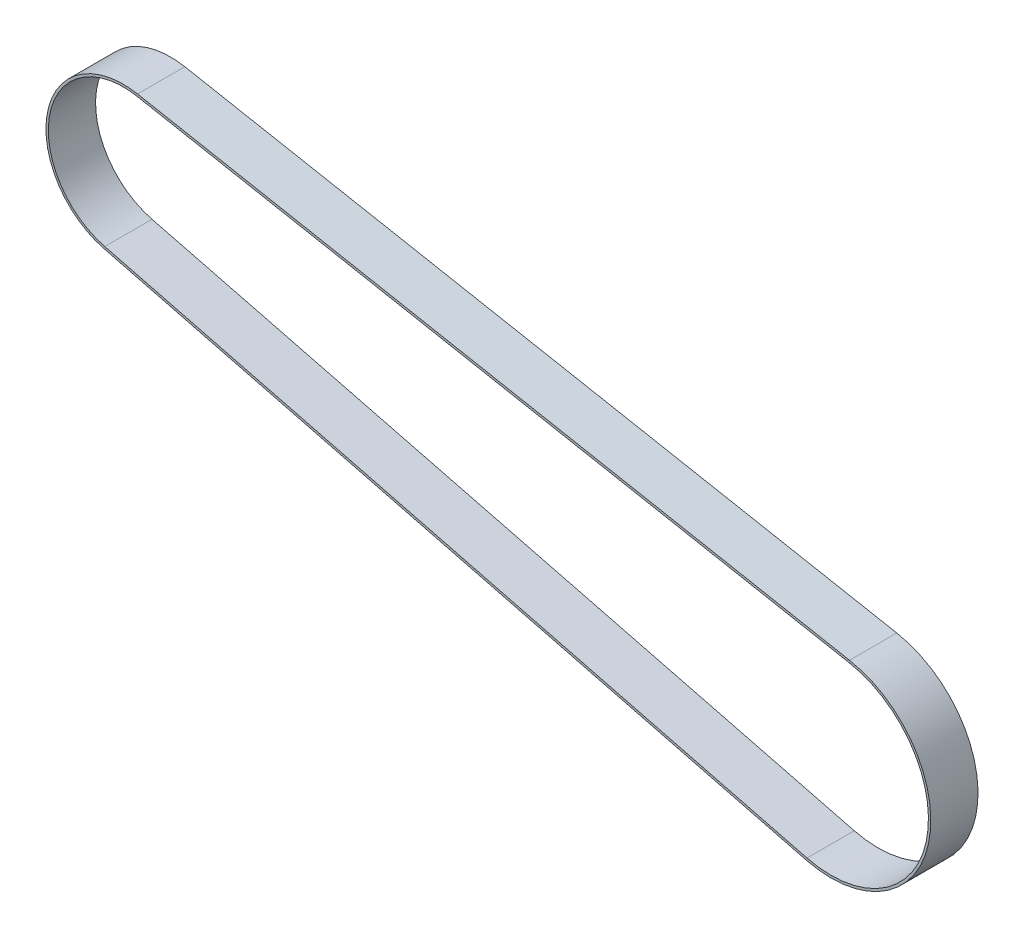
ISO-10303-21;
HEADER;
FILE_DESCRIPTION(('STEP AP214'),'2;1');
FILE_NAME('part.step','',(''),(''),'','','');
FILE_SCHEMA(('AUTOMOTIVE_DESIGN { 1 0 10303 214 1 1 1 1 }'));
ENDSEC;
DATA;
#1=APPLICATION_CONTEXT('core data for automotive mechanical design processes');
#2=APPLICATION_PROTOCOL_DEFINITION('international standard','automotive_design',2000,#1);
#3=PRODUCT_CONTEXT('',#1,'mechanical');
#4=PRODUCT('Part','Part','',(#3));
#5=PRODUCT_RELATED_PRODUCT_CATEGORY('part','',(#4));
#6=PRODUCT_DEFINITION_FORMATION('','',#4);
#7=PRODUCT_DEFINITION_CONTEXT('part definition',#1,'design');
#8=PRODUCT_DEFINITION('design','',#6,#7);
#9=PRODUCT_DEFINITION_SHAPE('','',#8);
#10=(LENGTH_UNIT() NAMED_UNIT(*) SI_UNIT(.MILLI.,.METRE.));
#11=(NAMED_UNIT(*) PLANE_ANGLE_UNIT() SI_UNIT($,.RADIAN.));
#12=(NAMED_UNIT(*) SI_UNIT($,.STERADIAN.) SOLID_ANGLE_UNIT());
#13=UNCERTAINTY_MEASURE_WITH_UNIT(LENGTH_MEASURE(1.E-05),#10,'distance_accuracy_value','');
#14=(GEOMETRIC_REPRESENTATION_CONTEXT(3) GLOBAL_UNCERTAINTY_ASSIGNED_CONTEXT((#13)) GLOBAL_UNIT_ASSIGNED_CONTEXT((#10,
#11,#12)) REPRESENTATION_CONTEXT('',''));
#15=CARTESIAN_POINT('',(0.,0.,0.));
#16=DIRECTION('',(0.,0.,1.));
#17=DIRECTION('',(1.,0.,0.));
#18=AXIS2_PLACEMENT_3D('',#15,#16,#17);
#19=CARTESIAN_POINT('',(-199.5170858323,189.8220419635,-593.0042454348));
#20=DIRECTION('',(-0.246269747610899,-0.969201326563096,0.));
#21=DIRECTION('',(-0.969201326563096,0.246269747610899,0.));
#22=AXIS2_PLACEMENT_3D('',#19,#20,#21);
#23=PLANE('',#22);
#24=DIRECTION('',(0.,0.,-1.));
#25=VECTOR('',#24,1.);
#26=CARTESIAN_POINT('',(-199.5170858323,189.8220419635,-593.0042454348));
#27=LINE('',#26,#25);
#28=CARTESIAN_POINT('',(-199.5170858323,189.8220419635,-593.0042454348));
#29=VERTEX_POINT('',#28);
#30=CARTESIAN_POINT('',(-199.5170858323,189.8220419635,-603.0042454348));
#31=VERTEX_POINT('',#30);
#32=EDGE_CURVE('E151',#29,#31,#27,.T.);
#33=ORIENTED_EDGE('',*,*,#32,.T.);
#34=DIRECTION('',(0.969201326563096,-0.246269747610899,0.));
#35=VECTOR('',#34,1.);
#36=CARTESIAN_POINT('',(-199.5170858323,189.8220419635,-603.0042454348));
#37=LINE('',#36,#35);
#38=CARTESIAN_POINT('',(-50.87227964401,152.0520576472,-603.0042454348));
#39=VERTEX_POINT('',#38);
#40=EDGE_CURVE('E174',#31,#39,#37,.T.);
#41=ORIENTED_EDGE('',*,*,#40,.T.);
#42=DIRECTION('',(0.,0.,-1.));
#43=VECTOR('',#42,1.);
#44=CARTESIAN_POINT('',(-50.87227964401,152.0520576472,-593.0042454348));
#45=LINE('',#44,#43);
#46=CARTESIAN_POINT('',(-50.87227964401,152.0520576472,-593.0042454348));
#47=VERTEX_POINT('',#46);
#48=EDGE_CURVE('E11',#47,#39,#45,.T.);
#49=ORIENTED_EDGE('',*,*,#48,.F.);
#50=DIRECTION('',(0.969201326563096,-0.246269747610899,0.));
#51=VECTOR('',#50,1.);
#52=CARTESIAN_POINT('',(-199.5170858323,189.8220419635,-593.0042454348));
#53=LINE('',#52,#51);
#54=EDGE_CURVE('E159',#29,#47,#53,.T.);
#55=ORIENTED_EDGE('',*,*,#54,.F.);
#56=EDGE_LOOP('',(#33,#41,#49,#55));
#57=FACE_BOUND('',#56,.T.);
#58=ADVANCED_FACE('F17',(#57),#23,.T.);
#59=CARTESIAN_POINT('',(-45.66983122573,172.5264356708,-599.0042454348));
#60=DIRECTION('',(0.,0.,1.));
#61=DIRECTION('',(0.246269747610899,0.969201326563096,0.));
#62=AXIS2_PLACEMENT_3D('',#59,#60,#61);
#63=CYLINDRICAL_SURFACE('',#62,21.125);
#64=ORIENTED_EDGE('',*,*,#48,.T.);
#65=CARTESIAN_POINT('',(-45.66983122573,172.5264356708,-603.0042454348));
#66=DIRECTION('',(0.,0.,1.));
#67=DIRECTION('',(-0.246269747610899,-0.969201326563096,0.));
#68=AXIS2_PLACEMENT_3D('',#65,#66,#67);
#69=CIRCLE('',#68,21.125);
#70=CARTESIAN_POINT('',(-41.7497786479,193.2845380115,-603.0042454348));
#71=VERTEX_POINT('',#70);
#72=EDGE_CURVE('E171',#39,#71,#69,.T.);
#73=ORIENTED_EDGE('',*,*,#72,.T.);
#74=DIRECTION('',(0.,0.,-1.));
#75=VECTOR('',#74,1.);
#76=CARTESIAN_POINT('',(-41.7497786479,193.2845380115,-593.0042454348));
#77=LINE('',#76,#75);
#78=CARTESIAN_POINT('',(-41.7497786479,193.2845380115,-593.0042454348));
#79=VERTEX_POINT('',#78);
#80=EDGE_CURVE('E28',#79,#71,#77,.T.);
#81=ORIENTED_EDGE('',*,*,#80,.F.);
#82=CARTESIAN_POINT('',(-45.66983122573,172.5264356708,-593.0042454348));
#83=DIRECTION('',(0.,0.,1.));
#84=DIRECTION('',(-0.246269747610899,-0.969201326563096,0.));
#85=AXIS2_PLACEMENT_3D('',#82,#83,#84);
#86=CIRCLE('',#85,21.125);
#87=EDGE_CURVE('E154',#47,#79,#86,.T.);
#88=ORIENTED_EDGE('',*,*,#87,.F.);
#89=EDGE_LOOP('',(#64,#73,#81,#88));
#90=FACE_BOUND('',#89,.T.);
#91=ADVANCED_FACE('F220',(#90),#63,.T.);
#92=CARTESIAN_POINT('',(-41.7497786479,193.2845380115,-593.0042454348));
#93=DIRECTION('',(0.185564619069106,0.982632063465129,0.));
#94=DIRECTION('',(0.,0.,-1.));
#95=AXIS2_PLACEMENT_3D('',#92,#93,#94);
#96=PLANE('',#95);
#97=ORIENTED_EDGE('',*,*,#80,.T.);
#98=DIRECTION('',(-0.982632063465129,0.185564619069106,0.));
#99=VECTOR('',#98,1.);
#100=CARTESIAN_POINT('',(-41.7497786479,193.2845380115,-603.0042454348));
#101=LINE('',#100,#99);
#102=CARTESIAN_POINT('',(-192.4544347653,221.7442770575,-603.0042454348));
#103=VERTEX_POINT('',#102);
#104=EDGE_CURVE('E175',#71,#103,#101,.T.);
#105=ORIENTED_EDGE('',*,*,#104,.T.);
#106=DIRECTION('',(0.,0.,-1.));
#107=VECTOR('',#106,1.);
#108=CARTESIAN_POINT('',(-192.4544347653,221.7442770575,-593.0042454348));
#109=LINE('',#108,#107);
#110=CARTESIAN_POINT('',(-192.4544347653,221.7442770575,-593.0042454348));
#111=VERTEX_POINT('',#110);
#112=EDGE_CURVE('E109',#111,#103,#109,.T.);
#113=ORIENTED_EDGE('',*,*,#112,.F.);
#114=DIRECTION('',(-0.982632063465129,0.185564619069106,0.));
#115=VECTOR('',#114,1.);
#116=CARTESIAN_POINT('',(-41.7497786479,193.2845380115,-593.0042454348));
#117=LINE('',#116,#115);
#118=EDGE_CURVE('E164',#79,#111,#117,.T.);
#119=ORIENTED_EDGE('',*,*,#118,.F.);
#120=EDGE_LOOP('',(#97,#105,#113,#119));
#121=FACE_BOUND('',#120,.T.);
#122=ADVANCED_FACE('F19',(#121),#96,.T.);
#123=CARTESIAN_POINT('',(-195.4893441101,205.6733296595,-599.0042454348));
#124=DIRECTION('',(0.,0.,1.));
#125=DIRECTION('',(-0.185564619069106,-0.982632063465129,0.));
#126=AXIS2_PLACEMENT_3D('',#123,#124,#125);
#127=CYLINDRICAL_SURFACE('',#126,16.355);
#128=ORIENTED_EDGE('',*,*,#112,.T.);
#129=CARTESIAN_POINT('',(-195.4893441101,205.6733296595,-603.0042454348));
#130=DIRECTION('',(0.,0.,1.));
#131=DIRECTION('',(0.185564619069106,0.982632063465129,0.));
#132=AXIS2_PLACEMENT_3D('',#129,#130,#131);
#133=CIRCLE('',#132,16.355);
#134=EDGE_CURVE('E127',#103,#31,#133,.T.);
#135=ORIENTED_EDGE('',*,*,#134,.T.);
#136=ORIENTED_EDGE('',*,*,#32,.F.);
#137=CARTESIAN_POINT('',(-195.4893441101,205.6733296595,-593.0042454348));
#138=DIRECTION('',(0.,0.,1.));
#139=DIRECTION('',(0.185564619069106,0.982632063465129,0.));
#140=AXIS2_PLACEMENT_3D('',#137,#138,#139);
#141=CIRCLE('',#140,16.355);
#142=EDGE_CURVE('E160',#111,#29,#141,.T.);
#143=ORIENTED_EDGE('',*,*,#142,.F.);
#144=EDGE_LOOP('',(#128,#135,#136,#143));
#145=FACE_BOUND('',#144,.T.);
#146=ADVANCED_FACE('F217',(#145),#127,.T.);
#147=CARTESIAN_POINT('',(-195.4893441101,205.6733296595,-603.0042454348));
#148=DIRECTION('',(0.,0.,1.));
#149=DIRECTION('',(1.,0.,0.));
#150=AXIS2_PLACEMENT_3D('',#147,#148,#149);
#151=PLANE('',#150);
#152=DIRECTION('',(-0.982632063465129,0.185564619069106,0.));
#153=VECTOR('',#152,1.);
#154=CARTESIAN_POINT('',(-41.84256095743,192.7932219798,-603.0042454348));
#155=LINE('',#154,#153);
#156=CARTESIAN_POINT('',(-41.84256095743,192.7932219798,-603.0042454348));
#157=VERTEX_POINT('',#156);
#158=CARTESIAN_POINT('',(-192.5472170748,221.2529610257,-603.0042454348));
#159=VERTEX_POINT('',#158);
#160=EDGE_CURVE('E143',#157,#159,#155,.T.);
#161=ORIENTED_EDGE('',*,*,#160,.T.);
#162=CARTESIAN_POINT('',(-195.4893441101,205.6733296595,-603.0042454348));
#163=DIRECTION('',(0.,0.,1.));
#164=DIRECTION('',(0.185564619069106,0.982632063465129,0.));
#165=AXIS2_PLACEMENT_3D('',#162,#163,#164);
#166=CIRCLE('',#165,15.855);
#167=CARTESIAN_POINT('',(-199.3939509585,190.3066426268,-603.0042454348));
#168=VERTEX_POINT('',#167);
#169=EDGE_CURVE('E122',#159,#168,#166,.T.);
#170=ORIENTED_EDGE('',*,*,#169,.T.);
#171=DIRECTION('',(0.969201326563096,-0.246269747610899,0.));
#172=VECTOR('',#171,1.);
#173=CARTESIAN_POINT('',(-199.3939509585,190.3066426268,-603.0042454348));
#174=LINE('',#173,#172);
#175=CARTESIAN_POINT('',(-50.74914477021,152.5366583105,-603.0042454348));
#176=VERTEX_POINT('',#175);
#177=EDGE_CURVE('E116',#168,#176,#174,.T.);
#178=ORIENTED_EDGE('',*,*,#177,.T.);
#179=CARTESIAN_POINT('',(-45.66983122573,172.5264356708,-603.0042454348));
#180=DIRECTION('',(0.,0.,1.));
#181=DIRECTION('',(-0.246269747610899,-0.969201326563096,0.));
#182=AXIS2_PLACEMENT_3D('',#179,#180,#181);
#183=CIRCLE('',#182,20.625);
#184=EDGE_CURVE('E120',#176,#157,#183,.T.);
#185=ORIENTED_EDGE('',*,*,#184,.T.);
#186=EDGE_LOOP('',(#161,#170,#178,#185));
#187=FACE_BOUND('',#186,.T.);
#188=ORIENTED_EDGE('',*,*,#134,.F.);
#189=ORIENTED_EDGE('',*,*,#104,.F.);
#190=ORIENTED_EDGE('',*,*,#72,.F.);
#191=ORIENTED_EDGE('',*,*,#40,.F.);
#192=EDGE_LOOP('',(#188,#189,#190,#191));
#193=FACE_BOUND('',#192,.T.);
#194=ADVANCED_FACE('F118',(#187,#193),#151,.F.);
#195=CARTESIAN_POINT('',(-199.3939509585,190.3066426268,-603.0042454348));
#196=DIRECTION('',(0.246269747610899,0.969201326563096,0.));
#197=DIRECTION('',(0.,0.,-1.));
#198=AXIS2_PLACEMENT_3D('',#195,#196,#197);
#199=PLANE('',#198);
#200=DIRECTION('',(0.,0.,1.));
#201=VECTOR('',#200,1.);
#202=CARTESIAN_POINT('',(-199.3939509585,190.3066426268,-603.0042454348));
#203=LINE('',#202,#201);
#204=CARTESIAN_POINT('',(-199.3939509585,190.3066426268,-593.0042454348));
#205=VERTEX_POINT('',#204);
#206=EDGE_CURVE('E181',#168,#205,#203,.T.);
#207=ORIENTED_EDGE('',*,*,#206,.T.);
#208=DIRECTION('',(0.969201326563096,-0.246269747610899,0.));
#209=VECTOR('',#208,1.);
#210=CARTESIAN_POINT('',(-199.3939509585,190.3066426268,-593.0042454348));
#211=LINE('',#210,#209);
#212=CARTESIAN_POINT('',(-50.74914477021,152.5366583105,-593.0042454348));
#213=VERTEX_POINT('',#212);
#214=EDGE_CURVE('E140',#205,#213,#211,.T.);
#215=ORIENTED_EDGE('',*,*,#214,.T.);
#216=DIRECTION('',(0.,0.,1.));
#217=VECTOR('',#216,1.);
#218=CARTESIAN_POINT('',(-50.74914477021,152.5366583105,-603.0042454348));
#219=LINE('',#218,#217);
#220=EDGE_CURVE('E133',#176,#213,#219,.T.);
#221=ORIENTED_EDGE('',*,*,#220,.F.);
#222=ORIENTED_EDGE('',*,*,#177,.F.);
#223=EDGE_LOOP('',(#207,#215,#221,#222));
#224=FACE_BOUND('',#223,.T.);
#225=ADVANCED_FACE('F138',(#224),#199,.T.);
#226=CARTESIAN_POINT('',(-45.66983122573,172.5264356708,-599.0042454348));
#227=DIRECTION('',(0.,0.,1.));
#228=DIRECTION('',(0.246269747610899,0.969201326563096,0.));
#229=AXIS2_PLACEMENT_3D('',#226,#227,#228);
#230=CYLINDRICAL_SURFACE('',#229,20.625);
#231=ORIENTED_EDGE('',*,*,#220,.T.);
#232=CARTESIAN_POINT('',(-45.66983122573,172.5264356708,-593.0042454348));
#233=DIRECTION('',(0.,0.,1.));
#234=DIRECTION('',(-0.246269747610899,-0.969201326563096,0.));
#235=AXIS2_PLACEMENT_3D('',#232,#233,#234);
#236=CIRCLE('',#235,20.625);
#237=CARTESIAN_POINT('',(-41.84256095743,192.7932219798,-593.0042454348));
#238=VERTEX_POINT('',#237);
#239=EDGE_CURVE('E170',#213,#238,#236,.T.);
#240=ORIENTED_EDGE('',*,*,#239,.T.);
#241=DIRECTION('',(0.,0.,1.));
#242=VECTOR('',#241,1.);
#243=CARTESIAN_POINT('',(-41.84256095743,192.7932219798,-603.0042454348));
#244=LINE('',#243,#242);
#245=EDGE_CURVE('E135',#157,#238,#244,.T.);
#246=ORIENTED_EDGE('',*,*,#245,.F.);
#247=ORIENTED_EDGE('',*,*,#184,.F.);
#248=EDGE_LOOP('',(#231,#240,#246,#247));
#249=FACE_BOUND('',#248,.T.);
#250=ADVANCED_FACE('F131',(#249),#230,.F.);
#251=CARTESIAN_POINT('',(-41.84256095743,192.7932219798,-603.0042454348));
#252=DIRECTION('',(-0.185564619069106,-0.982632063465129,0.));
#253=DIRECTION('',(-0.982632063465129,0.185564619069106,0.));
#254=AXIS2_PLACEMENT_3D('',#251,#252,#253);
#255=PLANE('',#254);
#256=ORIENTED_EDGE('',*,*,#245,.T.);
#257=DIRECTION('',(-0.982632063465129,0.185564619069106,0.));
#258=VECTOR('',#257,1.);
#259=CARTESIAN_POINT('',(-41.84256095743,192.7932219798,-593.0042454348));
#260=LINE('',#259,#258);
#261=CARTESIAN_POINT('',(-192.5472170748,221.2529610257,-593.0042454348));
#262=VERTEX_POINT('',#261);
#263=EDGE_CURVE('E21',#238,#262,#260,.T.);
#264=ORIENTED_EDGE('',*,*,#263,.T.);
#265=DIRECTION('',(0.,0.,1.));
#266=VECTOR('',#265,1.);
#267=CARTESIAN_POINT('',(-192.5472170748,221.2529610257,-603.0042454348));
#268=LINE('',#267,#266);
#269=EDGE_CURVE('E73',#159,#262,#268,.T.);
#270=ORIENTED_EDGE('',*,*,#269,.F.);
#271=ORIENTED_EDGE('',*,*,#160,.F.);
#272=EDGE_LOOP('',(#256,#264,#270,#271));
#273=FACE_BOUND('',#272,.T.);
#274=ADVANCED_FACE('F191',(#273),#255,.T.);
#275=CARTESIAN_POINT('',(-195.4893441101,205.6733296595,-599.0042454348));
#276=DIRECTION('',(0.,0.,1.));
#277=DIRECTION('',(-0.185564619069106,-0.982632063465129,0.));
#278=AXIS2_PLACEMENT_3D('',#275,#276,#277);
#279=CYLINDRICAL_SURFACE('',#278,15.855);
#280=ORIENTED_EDGE('',*,*,#269,.T.);
#281=CARTESIAN_POINT('',(-195.4893441101,205.6733296595,-593.0042454348));
#282=DIRECTION('',(0.,0.,1.));
#283=DIRECTION('',(0.185564619069106,0.982632063465129,0.));
#284=AXIS2_PLACEMENT_3D('',#281,#282,#283);
#285=CIRCLE('',#284,15.855);
#286=EDGE_CURVE('E158',#262,#205,#285,.T.);
#287=ORIENTED_EDGE('',*,*,#286,.T.);
#288=ORIENTED_EDGE('',*,*,#206,.F.);
#289=ORIENTED_EDGE('',*,*,#169,.F.);
#290=EDGE_LOOP('',(#280,#287,#288,#289));
#291=FACE_BOUND('',#290,.T.);
#292=ADVANCED_FACE('F195',(#291),#279,.F.);
#293=CARTESIAN_POINT('',(-195.4893441101,205.6733296595,-593.0042454348));
#294=DIRECTION('',(0.,0.,1.));
#295=DIRECTION('',(1.,0.,0.));
#296=AXIS2_PLACEMENT_3D('',#293,#294,#295);
#297=PLANE('',#296);
#298=ORIENTED_EDGE('',*,*,#286,.F.);
#299=ORIENTED_EDGE('',*,*,#263,.F.);
#300=ORIENTED_EDGE('',*,*,#239,.F.);
#301=ORIENTED_EDGE('',*,*,#214,.F.);
#302=EDGE_LOOP('',(#298,#299,#300,#301));
#303=FACE_BOUND('',#302,.T.);
#304=ORIENTED_EDGE('',*,*,#118,.T.);
#305=ORIENTED_EDGE('',*,*,#142,.T.);
#306=ORIENTED_EDGE('',*,*,#54,.T.);
#307=ORIENTED_EDGE('',*,*,#87,.T.);
#308=EDGE_LOOP('',(#304,#305,#306,#307));
#309=FACE_BOUND('',#308,.T.);
#310=ADVANCED_FACE('F193',(#303,#309),#297,.T.);
#311=CLOSED_SHELL('',(#58,#91,#122,#146,#194,#225,#250,#274,#292,#310));
#312=MANIFOLD_SOLID_BREP('B1',#311);
#313=ADVANCED_BREP_SHAPE_REPRESENTATION('',(#18,#312),#14);
#314=SHAPE_DEFINITION_REPRESENTATION(#9,#313);
ENDSEC;
END-ISO-10303-21;
